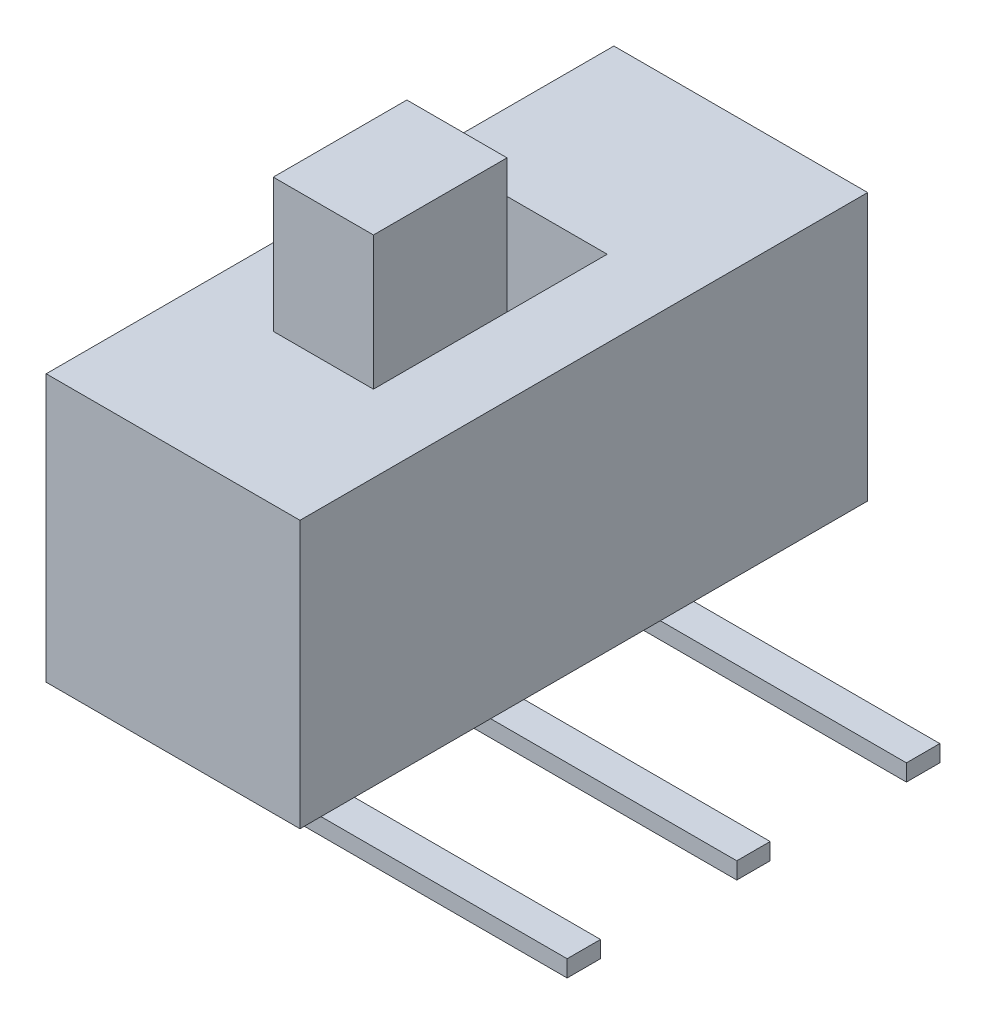
ISO-10303-21;
HEADER;
FILE_DESCRIPTION(('STEP AP214'),'2;1');
FILE_NAME('part.step','',(''),(''),'','','');
FILE_SCHEMA(('AUTOMOTIVE_DESIGN { 1 0 10303 214 1 1 1 1 }'));
ENDSEC;
DATA;
#1=APPLICATION_CONTEXT('core data for automotive mechanical design processes');
#2=APPLICATION_PROTOCOL_DEFINITION('international standard','automotive_design',2000,#1);
#3=PRODUCT_CONTEXT('',#1,'mechanical');
#4=PRODUCT('Part','Part','',(#3));
#5=PRODUCT_RELATED_PRODUCT_CATEGORY('part','',(#4));
#6=PRODUCT_DEFINITION_FORMATION('','',#4);
#7=PRODUCT_DEFINITION_CONTEXT('part definition',#1,'design');
#8=PRODUCT_DEFINITION('design','',#6,#7);
#9=PRODUCT_DEFINITION_SHAPE('','',#8);
#10=(LENGTH_UNIT() NAMED_UNIT(*) SI_UNIT(.MILLI.,.METRE.));
#11=(NAMED_UNIT(*) PLANE_ANGLE_UNIT() SI_UNIT($,.RADIAN.));
#12=(NAMED_UNIT(*) SI_UNIT($,.STERADIAN.) SOLID_ANGLE_UNIT());
#13=UNCERTAINTY_MEASURE_WITH_UNIT(LENGTH_MEASURE(1.E-05),#10,'distance_accuracy_value','');
#14=(GEOMETRIC_REPRESENTATION_CONTEXT(3) GLOBAL_UNCERTAINTY_ASSIGNED_CONTEXT((#13)) GLOBAL_UNIT_ASSIGNED_CONTEXT((#10,
#11,#12)) REPRESENTATION_CONTEXT('',''));
#15=CARTESIAN_POINT('',(0.,0.,0.));
#16=DIRECTION('',(0.,0.,1.));
#17=DIRECTION('',(1.,0.,0.));
#18=AXIS2_PLACEMENT_3D('',#15,#16,#17);
#19=CARTESIAN_POINT('',(-1.9,0.,4.25));
#20=DIRECTION('',(0.,1.,0.));
#21=DIRECTION('',(0.,0.,1.));
#22=AXIS2_PLACEMENT_3D('',#19,#20,#21);
#23=PLANE('',#22);
#24=DIRECTION('',(-1.,0.,0.));
#25=VECTOR('',#24,1.);
#26=CARTESIAN_POINT('',(-0.124999999999999,0.,2.79));
#27=LINE('',#26,#25);
#28=CARTESIAN_POINT('',(0.125000000000001,0.,2.79));
#29=VERTEX_POINT('',#28);
#30=CARTESIAN_POINT('',(-0.124999999999999,0.,2.79));
#31=VERTEX_POINT('',#30);
#32=EDGE_CURVE('E282',#29,#31,#27,.T.);
#33=ORIENTED_EDGE('',*,*,#32,.F.);
#34=DIRECTION('',(0.,0.,1.));
#35=VECTOR('',#34,1.);
#36=CARTESIAN_POINT('',(0.125000000000001,0.,2.79));
#37=LINE('',#36,#35);
#38=CARTESIAN_POINT('',(0.125000000000001,0.,2.29));
#39=VERTEX_POINT('',#38);
#40=EDGE_CURVE('E292',#39,#29,#37,.T.);
#41=ORIENTED_EDGE('',*,*,#40,.F.);
#42=DIRECTION('',(1.,0.,0.));
#43=VECTOR('',#42,1.);
#44=CARTESIAN_POINT('',(-0.124999999999999,0.,2.29));
#45=LINE('',#44,#43);
#46=CARTESIAN_POINT('',(-0.124999999999999,0.,2.29));
#47=VERTEX_POINT('',#46);
#48=EDGE_CURVE('E289',#47,#39,#45,.T.);
#49=ORIENTED_EDGE('',*,*,#48,.F.);
#50=DIRECTION('',(0.,0.,-1.));
#51=VECTOR('',#50,1.);
#52=CARTESIAN_POINT('',(-0.124999999999999,0.,2.79));
#53=LINE('',#52,#51);
#54=EDGE_CURVE('E285',#31,#47,#53,.T.);
#55=ORIENTED_EDGE('',*,*,#54,.F.);
#56=EDGE_LOOP('',(#33,#41,#49,#55));
#57=FACE_BOUND('',#56,.T.);
#58=DIRECTION('',(0.,0.,1.));
#59=VECTOR('',#58,1.);
#60=CARTESIAN_POINT('',(-1.9,0.,-4.25));
#61=LINE('',#60,#59);
#62=CARTESIAN_POINT('',(-1.9,0.,-4.25));
#63=VERTEX_POINT('',#62);
#64=CARTESIAN_POINT('',(-1.9,0.,4.25));
#65=VERTEX_POINT('',#64);
#66=EDGE_CURVE('E389',#63,#65,#61,.T.);
#67=ORIENTED_EDGE('',*,*,#66,.F.);
#68=DIRECTION('',(-1.,0.,0.));
#69=VECTOR('',#68,1.);
#70=CARTESIAN_POINT('',(-1.9,0.,-4.25));
#71=LINE('',#70,#69);
#72=CARTESIAN_POINT('',(1.9,0.,-4.25));
#73=VERTEX_POINT('',#72);
#74=EDGE_CURVE('E381',#73,#63,#71,.T.);
#75=ORIENTED_EDGE('',*,*,#74,.F.);
#76=DIRECTION('',(0.,0.,-1.));
#77=VECTOR('',#76,1.);
#78=CARTESIAN_POINT('',(1.9,0.,-4.25));
#79=LINE('',#78,#77);
#80=CARTESIAN_POINT('',(1.90000000000002,0.,4.25));
#81=VERTEX_POINT('',#80);
#82=EDGE_CURVE('E376',#81,#73,#79,.T.);
#83=ORIENTED_EDGE('',*,*,#82,.F.);
#84=DIRECTION('',(1.,0.,0.));
#85=VECTOR('',#84,1.);
#86=CARTESIAN_POINT('',(-1.9,0.,4.25));
#87=LINE('',#86,#85);
#88=EDGE_CURVE('E377',#65,#81,#87,.T.);
#89=ORIENTED_EDGE('',*,*,#88,.F.);
#90=EDGE_LOOP('',(#67,#75,#83,#89));
#91=FACE_BOUND('',#90,.T.);
#92=DIRECTION('',(0.,0.,-1.));
#93=VECTOR('',#92,1.);
#94=CARTESIAN_POINT('',(-0.124999999999999,0.,0.25));
#95=LINE('',#94,#93);
#96=CARTESIAN_POINT('',(-0.124999999999999,0.,0.25));
#97=VERTEX_POINT('',#96);
#98=CARTESIAN_POINT('',(-0.124999999999999,0.,-0.25));
#99=VERTEX_POINT('',#98);
#100=EDGE_CURVE('E266',#97,#99,#95,.T.);
#101=ORIENTED_EDGE('',*,*,#100,.F.);
#102=DIRECTION('',(-1.,0.,0.));
#103=VECTOR('',#102,1.);
#104=CARTESIAN_POINT('',(-0.124999999999999,0.,0.25));
#105=LINE('',#104,#103);
#106=CARTESIAN_POINT('',(0.125000000000001,0.,0.25));
#107=VERTEX_POINT('',#106);
#108=EDGE_CURVE('E343',#107,#97,#105,.T.);
#109=ORIENTED_EDGE('',*,*,#108,.F.);
#110=DIRECTION('',(0.,0.,1.));
#111=VECTOR('',#110,1.);
#112=CARTESIAN_POINT('',(0.125000000000001,0.,0.25));
#113=LINE('',#112,#111);
#114=CARTESIAN_POINT('',(0.125000000000001,0.,-0.25));
#115=VERTEX_POINT('',#114);
#116=EDGE_CURVE('E340',#115,#107,#113,.T.);
#117=ORIENTED_EDGE('',*,*,#116,.F.);
#118=DIRECTION('',(1.,0.,0.));
#119=VECTOR('',#118,1.);
#120=CARTESIAN_POINT('',(-0.124999999999999,0.,-0.25));
#121=LINE('',#120,#119);
#122=EDGE_CURVE('E337',#99,#115,#121,.T.);
#123=ORIENTED_EDGE('',*,*,#122,.F.);
#124=EDGE_LOOP('',(#101,#109,#117,#123));
#125=FACE_BOUND('',#124,.T.);
#126=DIRECTION('',(0.,0.,-1.));
#127=VECTOR('',#126,1.);
#128=CARTESIAN_POINT('',(-0.124999999999999,0.,-2.79));
#129=LINE('',#128,#127);
#130=CARTESIAN_POINT('',(-0.124999999999999,0.,-2.29));
#131=VERTEX_POINT('',#130);
#132=CARTESIAN_POINT('',(-0.124999999999999,0.,-2.79));
#133=VERTEX_POINT('',#132);
#134=EDGE_CURVE('E60',#131,#133,#129,.T.);
#135=ORIENTED_EDGE('',*,*,#134,.F.);
#136=DIRECTION('',(-1.,0.,0.));
#137=VECTOR('',#136,1.);
#138=CARTESIAN_POINT('',(-0.124999999999999,0.,-2.29));
#139=LINE('',#138,#137);
#140=CARTESIAN_POINT('',(0.125000000000001,0.,-2.29));
#141=VERTEX_POINT('',#140);
#142=EDGE_CURVE('E218',#141,#131,#139,.T.);
#143=ORIENTED_EDGE('',*,*,#142,.F.);
#144=DIRECTION('',(0.,0.,1.));
#145=VECTOR('',#144,1.);
#146=CARTESIAN_POINT('',(0.125000000000001,0.,-2.79));
#147=LINE('',#146,#145);
#148=CARTESIAN_POINT('',(0.125000000000001,0.,-2.79));
#149=VERTEX_POINT('',#148);
#150=EDGE_CURVE('E215',#149,#141,#147,.T.);
#151=ORIENTED_EDGE('',*,*,#150,.F.);
#152=DIRECTION('',(1.,0.,0.));
#153=VECTOR('',#152,1.);
#154=CARTESIAN_POINT('',(-0.124999999999999,0.,-2.79));
#155=LINE('',#154,#153);
#156=EDGE_CURVE('E65',#133,#149,#155,.T.);
#157=ORIENTED_EDGE('',*,*,#156,.F.);
#158=EDGE_LOOP('',(#135,#143,#151,#157));
#159=FACE_BOUND('',#158,.T.);
#160=ADVANCED_FACE('F43',(#57,#91,#125,#159),#23,.F.);
#161=CARTESIAN_POINT('',(-1.9,4.,4.25));
#162=DIRECTION('',(0.,1.,0.));
#163=DIRECTION('',(0.,0.,1.));
#164=AXIS2_PLACEMENT_3D('',#161,#162,#163);
#165=PLANE('',#164);
#166=DIRECTION('',(-1.,0.,0.));
#167=VECTOR('',#166,1.);
#168=CARTESIAN_POINT('',(0.75,4.,-1.5));
#169=LINE('',#168,#167);
#170=CARTESIAN_POINT('',(0.75,4.,-1.5));
#171=VERTEX_POINT('',#170);
#172=CARTESIAN_POINT('',(-0.75,4.,-1.5));
#173=VERTEX_POINT('',#172);
#174=EDGE_CURVE('E407',#171,#173,#169,.T.);
#175=ORIENTED_EDGE('',*,*,#174,.F.);
#176=DIRECTION('',(0.,0.,-1.));
#177=VECTOR('',#176,1.);
#178=CARTESIAN_POINT('',(0.75,4.,0.));
#179=LINE('',#178,#177);
#180=CARTESIAN_POINT('',(0.75,4.,2.));
#181=VERTEX_POINT('',#180);
#182=EDGE_CURVE('E385',#181,#171,#179,.T.);
#183=ORIENTED_EDGE('',*,*,#182,.F.);
#184=DIRECTION('',(1.,0.,0.));
#185=VECTOR('',#184,1.);
#186=CARTESIAN_POINT('',(0.75,4.,2.));
#187=LINE('',#186,#185);
#188=CARTESIAN_POINT('',(-0.75,4.,2.));
#189=VERTEX_POINT('',#188);
#190=EDGE_CURVE('E47',#189,#181,#187,.T.);
#191=ORIENTED_EDGE('',*,*,#190,.F.);
#192=DIRECTION('',(0.,0.,1.));
#193=VECTOR('',#192,1.);
#194=CARTESIAN_POINT('',(-0.75,4.,-1.5));
#195=LINE('',#194,#193);
#196=EDGE_CURVE('E410',#173,#189,#195,.T.);
#197=ORIENTED_EDGE('',*,*,#196,.F.);
#198=EDGE_LOOP('',(#175,#183,#191,#197));
#199=FACE_BOUND('',#198,.T.);
#200=DIRECTION('',(0.,0.,1.));
#201=VECTOR('',#200,1.);
#202=CARTESIAN_POINT('',(-1.9,4.,-4.25));
#203=LINE('',#202,#201);
#204=CARTESIAN_POINT('',(-1.9,4.,-4.25));
#205=VERTEX_POINT('',#204);
#206=CARTESIAN_POINT('',(-1.9,4.,4.25));
#207=VERTEX_POINT('',#206);
#208=EDGE_CURVE('E322',#205,#207,#203,.T.);
#209=ORIENTED_EDGE('',*,*,#208,.T.);
#210=DIRECTION('',(1.,0.,0.));
#211=VECTOR('',#210,1.);
#212=CARTESIAN_POINT('',(-1.9,4.,4.25));
#213=LINE('',#212,#211);
#214=CARTESIAN_POINT('',(1.90000000000002,4.,4.25));
#215=VERTEX_POINT('',#214);
#216=EDGE_CURVE('E394',#207,#215,#213,.T.);
#217=ORIENTED_EDGE('',*,*,#216,.T.);
#218=DIRECTION('',(0.,0.,-1.));
#219=VECTOR('',#218,1.);
#220=CARTESIAN_POINT('',(1.9,4.,-4.25));
#221=LINE('',#220,#219);
#222=CARTESIAN_POINT('',(1.9,4.,-4.25));
#223=VERTEX_POINT('',#222);
#224=EDGE_CURVE('E392',#215,#223,#221,.T.);
#225=ORIENTED_EDGE('',*,*,#224,.T.);
#226=DIRECTION('',(-1.,0.,0.));
#227=VECTOR('',#226,1.);
#228=CARTESIAN_POINT('',(-1.9,4.,-4.25));
#229=LINE('',#228,#227);
#230=EDGE_CURVE('E390',#223,#205,#229,.T.);
#231=ORIENTED_EDGE('',*,*,#230,.T.);
#232=EDGE_LOOP('',(#209,#217,#225,#231));
#233=FACE_BOUND('',#232,.T.);
#234=ADVANCED_FACE('F437',(#199,#233),#165,.T.);
#235=CARTESIAN_POINT('',(-1.9,4.,-4.25));
#236=DIRECTION('',(1.,0.,0.));
#237=DIRECTION('',(0.,0.,-1.));
#238=AXIS2_PLACEMENT_3D('',#235,#236,#237);
#239=PLANE('',#238);
#240=ORIENTED_EDGE('',*,*,#66,.T.);
#241=DIRECTION('',(0.,-1.,0.));
#242=VECTOR('',#241,1.);
#243=CARTESIAN_POINT('',(-1.9,4.,4.25));
#244=LINE('',#243,#242);
#245=EDGE_CURVE('E373',#207,#65,#244,.T.);
#246=ORIENTED_EDGE('',*,*,#245,.F.);
#247=ORIENTED_EDGE('',*,*,#208,.F.);
#248=DIRECTION('',(0.,-1.,0.));
#249=VECTOR('',#248,1.);
#250=CARTESIAN_POINT('',(-1.9,4.,-4.25));
#251=LINE('',#250,#249);
#252=EDGE_CURVE('E386',#205,#63,#251,.T.);
#253=ORIENTED_EDGE('',*,*,#252,.T.);
#254=EDGE_LOOP('',(#240,#246,#247,#253));
#255=FACE_BOUND('',#254,.T.);
#256=ADVANCED_FACE('F460',(#255),#239,.F.);
#257=CARTESIAN_POINT('',(-1.9,4.,4.25));
#258=DIRECTION('',(0.,0.,-1.));
#259=DIRECTION('',(-1.,0.,0.));
#260=AXIS2_PLACEMENT_3D('',#257,#258,#259);
#261=PLANE('',#260);
#262=ORIENTED_EDGE('',*,*,#88,.T.);
#263=DIRECTION('',(0.,-1.,0.));
#264=VECTOR('',#263,1.);
#265=CARTESIAN_POINT('',(1.90000000000002,4.,4.25));
#266=LINE('',#265,#264);
#267=EDGE_CURVE('E378',#215,#81,#266,.T.);
#268=ORIENTED_EDGE('',*,*,#267,.F.);
#269=ORIENTED_EDGE('',*,*,#216,.F.);
#270=ORIENTED_EDGE('',*,*,#245,.T.);
#271=EDGE_LOOP('',(#262,#268,#269,#270));
#272=FACE_BOUND('',#271,.T.);
#273=ADVANCED_FACE('F680',(#272),#261,.F.);
#274=CARTESIAN_POINT('',(1.9,4.,-4.25));
#275=DIRECTION('',(-1.,0.,0.));
#276=DIRECTION('',(0.,0.,1.));
#277=AXIS2_PLACEMENT_3D('',#274,#275,#276);
#278=PLANE('',#277);
#279=ORIENTED_EDGE('',*,*,#82,.T.);
#280=DIRECTION('',(0.,-1.,0.));
#281=VECTOR('',#280,1.);
#282=CARTESIAN_POINT('',(1.9,4.,-4.25));
#283=LINE('',#282,#281);
#284=EDGE_CURVE('E382',#223,#73,#283,.T.);
#285=ORIENTED_EDGE('',*,*,#284,.F.);
#286=ORIENTED_EDGE('',*,*,#224,.F.);
#287=ORIENTED_EDGE('',*,*,#267,.T.);
#288=EDGE_LOOP('',(#279,#285,#286,#287));
#289=FACE_BOUND('',#288,.T.);
#290=ADVANCED_FACE('F684',(#289),#278,.F.);
#291=CARTESIAN_POINT('',(-1.9,4.,-4.25));
#292=DIRECTION('',(0.,0.,1.));
#293=DIRECTION('',(1.,0.,0.));
#294=AXIS2_PLACEMENT_3D('',#291,#292,#293);
#295=PLANE('',#294);
#296=ORIENTED_EDGE('',*,*,#74,.T.);
#297=ORIENTED_EDGE('',*,*,#252,.F.);
#298=ORIENTED_EDGE('',*,*,#230,.F.);
#299=ORIENTED_EDGE('',*,*,#284,.T.);
#300=EDGE_LOOP('',(#296,#297,#298,#299));
#301=FACE_BOUND('',#300,.T.);
#302=ADVANCED_FACE('F466',(#301),#295,.F.);
#303=CARTESIAN_POINT('',(0.75,2.,-1.5));
#304=DIRECTION('',(1.,0.,0.));
#305=DIRECTION('',(0.,0.,-1.));
#306=AXIS2_PLACEMENT_3D('',#303,#304,#305);
#307=PLANE('',#306);
#308=ORIENTED_EDGE('',*,*,#182,.T.);
#309=DIRECTION('',(0.,1.,0.));
#310=VECTOR('',#309,1.);
#311=CARTESIAN_POINT('',(0.75,2.,-1.5));
#312=LINE('',#311,#310);
#313=CARTESIAN_POINT('',(0.75,2.,-1.5));
#314=VERTEX_POINT('',#313);
#315=EDGE_CURVE('E403',#314,#171,#312,.T.);
#316=ORIENTED_EDGE('',*,*,#315,.F.);
#317=DIRECTION('',(0.,0.,-1.));
#318=VECTOR('',#317,1.);
#319=CARTESIAN_POINT('',(0.75,2.,-1.5));
#320=LINE('',#319,#318);
#321=CARTESIAN_POINT('',(0.75,2.,2.));
#322=VERTEX_POINT('',#321);
#323=EDGE_CURVE('E406',#322,#314,#320,.T.);
#324=ORIENTED_EDGE('',*,*,#323,.F.);
#325=DIRECTION('',(0.,1.,0.));
#326=VECTOR('',#325,1.);
#327=CARTESIAN_POINT('',(0.75,2.,2.));
#328=LINE('',#327,#326);
#329=EDGE_CURVE('E414',#322,#181,#328,.T.);
#330=ORIENTED_EDGE('',*,*,#329,.T.);
#331=EDGE_LOOP('',(#308,#316,#324,#330));
#332=FACE_BOUND('',#331,.T.);
#333=ADVANCED_FACE('F428',(#332),#307,.F.);
#334=CARTESIAN_POINT('',(0.75,2.,2.));
#335=DIRECTION('',(0.,0.,1.));
#336=DIRECTION('',(1.,0.,0.));
#337=AXIS2_PLACEMENT_3D('',#334,#335,#336);
#338=PLANE('',#337);
#339=ORIENTED_EDGE('',*,*,#190,.T.);
#340=ORIENTED_EDGE('',*,*,#329,.F.);
#341=DIRECTION('',(1.,0.,0.));
#342=VECTOR('',#341,1.);
#343=CARTESIAN_POINT('',(0.75,2.,2.));
#344=LINE('',#343,#342);
#345=CARTESIAN_POINT('',(-0.75,2.,2.));
#346=VERTEX_POINT('',#345);
#347=EDGE_CURVE('E13',#346,#322,#344,.T.);
#348=ORIENTED_EDGE('',*,*,#347,.F.);
#349=DIRECTION('',(0.,1.,0.));
#350=VECTOR('',#349,1.);
#351=CARTESIAN_POINT('',(-0.75,2.,2.));
#352=LINE('',#351,#350);
#353=EDGE_CURVE('E411',#346,#189,#352,.T.);
#354=ORIENTED_EDGE('',*,*,#353,.T.);
#355=EDGE_LOOP('',(#339,#340,#348,#354));
#356=FACE_BOUND('',#355,.T.);
#357=ADVANCED_FACE('F444',(#356),#338,.F.);
#358=CARTESIAN_POINT('',(-0.75,2.,-1.5));
#359=DIRECTION('',(-1.,0.,0.));
#360=DIRECTION('',(0.,0.,1.));
#361=AXIS2_PLACEMENT_3D('',#358,#359,#360);
#362=PLANE('',#361);
#363=ORIENTED_EDGE('',*,*,#196,.T.);
#364=ORIENTED_EDGE('',*,*,#353,.F.);
#365=DIRECTION('',(0.,0.,1.));
#366=VECTOR('',#365,1.);
#367=CARTESIAN_POINT('',(-0.75,2.,-1.5));
#368=LINE('',#367,#366);
#369=CARTESIAN_POINT('',(-0.75,2.,-1.5));
#370=VERTEX_POINT('',#369);
#371=EDGE_CURVE('E52',#370,#346,#368,.T.);
#372=ORIENTED_EDGE('',*,*,#371,.F.);
#373=DIRECTION('',(0.,1.,0.));
#374=VECTOR('',#373,1.);
#375=CARTESIAN_POINT('',(-0.75,2.,-1.5));
#376=LINE('',#375,#374);
#377=EDGE_CURVE('E408',#370,#173,#376,.T.);
#378=ORIENTED_EDGE('',*,*,#377,.T.);
#379=EDGE_LOOP('',(#363,#364,#372,#378));
#380=FACE_BOUND('',#379,.T.);
#381=ADVANCED_FACE('F440',(#380),#362,.F.);
#382=CARTESIAN_POINT('',(0.75,2.,-1.5));
#383=DIRECTION('',(0.,0.,-1.));
#384=DIRECTION('',(-1.,0.,0.));
#385=AXIS2_PLACEMENT_3D('',#382,#383,#384);
#386=PLANE('',#385);
#387=ORIENTED_EDGE('',*,*,#174,.T.);
#388=ORIENTED_EDGE('',*,*,#377,.F.);
#389=DIRECTION('',(-1.,0.,0.));
#390=VECTOR('',#389,1.);
#391=CARTESIAN_POINT('',(0.75,2.,-1.5));
#392=LINE('',#391,#390);
#393=EDGE_CURVE('E419',#314,#370,#392,.T.);
#394=ORIENTED_EDGE('',*,*,#393,.F.);
#395=ORIENTED_EDGE('',*,*,#315,.T.);
#396=EDGE_LOOP('',(#387,#388,#394,#395));
#397=FACE_BOUND('',#396,.T.);
#398=ADVANCED_FACE('F435',(#397),#386,.F.);
#399=CARTESIAN_POINT('',(0.75,2.,2.));
#400=DIRECTION('',(0.,-1.,0.));
#401=DIRECTION('',(0.,0.,-1.));
#402=AXIS2_PLACEMENT_3D('',#399,#400,#401);
#403=PLANE('',#402);
#404=ORIENTED_EDGE('',*,*,#323,.T.);
#405=ORIENTED_EDGE('',*,*,#393,.T.);
#406=ORIENTED_EDGE('',*,*,#371,.T.);
#407=ORIENTED_EDGE('',*,*,#347,.T.);
#408=EDGE_LOOP('',(#404,#405,#406,#407));
#409=FACE_BOUND('',#408,.T.);
#410=ADVANCED_FACE('F45',(#409),#403,.F.);
#411=CARTESIAN_POINT('',(0.125000000000002,-1.145,0.250000000000001));
#412=DIRECTION('',(0.,1.,0.));
#413=DIRECTION('',(0.,0.,1.));
#414=AXIS2_PLACEMENT_3D('',#411,#412,#413);
#415=PLANE('',#414);
#416=DIRECTION('',(1.,0.,0.));
#417=VECTOR('',#416,1.);
#418=CARTESIAN_POINT('',(0.125000000000002,-1.145,0.25));
#419=LINE('',#418,#417);
#420=CARTESIAN_POINT('',(0.125000000000002,-1.145,0.25));
#421=VERTEX_POINT('',#420);
#422=CARTESIAN_POINT('',(4.44000000000002,-1.145,0.25));
#423=VERTEX_POINT('',#422);
#424=EDGE_CURVE('E359',#421,#423,#419,.T.);
#425=ORIENTED_EDGE('',*,*,#424,.T.);
#426=DIRECTION('',(0.,0.,-1.));
#427=VECTOR('',#426,1.);
#428=CARTESIAN_POINT('',(4.44000000000002,-1.145,0.250000000000001));
#429=LINE('',#428,#427);
#430=CARTESIAN_POINT('',(4.44000000000002,-1.145,-0.25));
#431=VERTEX_POINT('',#430);
#432=EDGE_CURVE('E323',#423,#431,#429,.T.);
#433=ORIENTED_EDGE('',*,*,#432,.T.);
#434=DIRECTION('',(1.,0.,0.));
#435=VECTOR('',#434,1.);
#436=CARTESIAN_POINT('',(0.125000000000002,-1.145,-0.25));
#437=LINE('',#436,#435);
#438=CARTESIAN_POINT('',(0.125000000000002,-1.145,-0.25));
#439=VERTEX_POINT('',#438);
#440=EDGE_CURVE('E362',#439,#431,#437,.T.);
#441=ORIENTED_EDGE('',*,*,#440,.F.);
#442=DIRECTION('',(0.,0.,1.));
#443=VECTOR('',#442,1.);
#444=CARTESIAN_POINT('',(0.125000000000002,-1.145,0.250000000000001));
#445=LINE('',#444,#443);
#446=EDGE_CURVE('E330',#439,#421,#445,.T.);
#447=ORIENTED_EDGE('',*,*,#446,.T.);
#448=EDGE_LOOP('',(#425,#433,#441,#447));
#449=FACE_BOUND('',#448,.T.);
#450=ADVANCED_FACE('F447',(#449),#415,.T.);
#451=CARTESIAN_POINT('',(-0.124999999999998,-1.395,0.25));
#452=DIRECTION('',(0.,-1.,0.));
#453=DIRECTION('',(0.,0.,-1.));
#454=AXIS2_PLACEMENT_3D('',#451,#452,#453);
#455=PLANE('',#454);
#456=DIRECTION('',(1.,0.,0.));
#457=VECTOR('',#456,1.);
#458=CARTESIAN_POINT('',(-0.124999999999998,-1.395,-0.25));
#459=LINE('',#458,#457);
#460=CARTESIAN_POINT('',(-0.124999999999998,-1.395,-0.25));
#461=VERTEX_POINT('',#460);
#462=CARTESIAN_POINT('',(4.44000000000002,-1.395,-0.25));
#463=VERTEX_POINT('',#462);
#464=EDGE_CURVE('E365',#461,#463,#459,.T.);
#465=ORIENTED_EDGE('',*,*,#464,.T.);
#466=DIRECTION('',(0.,0.,1.));
#467=VECTOR('',#466,1.);
#468=CARTESIAN_POINT('',(4.44000000000002,-1.395,0.25));
#469=LINE('',#468,#467);
#470=CARTESIAN_POINT('',(4.44000000000002,-1.395,0.25));
#471=VERTEX_POINT('',#470);
#472=EDGE_CURVE('E329',#463,#471,#469,.T.);
#473=ORIENTED_EDGE('',*,*,#472,.T.);
#474=DIRECTION('',(1.,0.,0.));
#475=VECTOR('',#474,1.);
#476=CARTESIAN_POINT('',(-0.124999999999998,-1.395,0.25));
#477=LINE('',#476,#475);
#478=CARTESIAN_POINT('',(-0.124999999999998,-1.395,0.25));
#479=VERTEX_POINT('',#478);
#480=EDGE_CURVE('E368',#479,#471,#477,.T.);
#481=ORIENTED_EDGE('',*,*,#480,.F.);
#482=DIRECTION('',(0.,0.,-1.));
#483=VECTOR('',#482,1.);
#484=CARTESIAN_POINT('',(-0.124999999999998,-1.395,0.25));
#485=LINE('',#484,#483);
#486=EDGE_CURVE('E333',#479,#461,#485,.T.);
#487=ORIENTED_EDGE('',*,*,#486,.T.);
#488=EDGE_LOOP('',(#465,#473,#481,#487));
#489=FACE_BOUND('',#488,.T.);
#490=ADVANCED_FACE('F451',(#489),#455,.T.);
#491=CARTESIAN_POINT('',(-0.124999999999998,-1.82901699437495,0.25));
#492=DIRECTION('',(0.,0.,-1.));
#493=DIRECTION('',(-1.,0.,0.));
#494=AXIS2_PLACEMENT_3D('',#491,#492,#493);
#495=PLANE('',#494);
#496=DIRECTION('',(0.,1.,0.));
#497=VECTOR('',#496,1.);
#498=CARTESIAN_POINT('',(-0.124999999999998,-1.82901699437495,0.25));
#499=LINE('',#498,#497);
#500=EDGE_CURVE('E346',#479,#97,#499,.T.);
#501=ORIENTED_EDGE('',*,*,#500,.F.);
#502=ORIENTED_EDGE('',*,*,#480,.T.);
#503=DIRECTION('',(0.,1.,0.));
#504=VECTOR('',#503,1.);
#505=CARTESIAN_POINT('',(4.44000000000002,-1.61200849718747,0.25));
#506=LINE('',#505,#504);
#507=EDGE_CURVE('E326',#471,#423,#506,.T.);
#508=ORIENTED_EDGE('',*,*,#507,.T.);
#509=ORIENTED_EDGE('',*,*,#424,.F.);
#510=DIRECTION('',(0.,1.,0.));
#511=VECTOR('',#510,1.);
#512=CARTESIAN_POINT('',(0.125000000000002,-1.82901699437495,0.25));
#513=LINE('',#512,#511);
#514=EDGE_CURVE('E349',#421,#107,#513,.T.);
#515=ORIENTED_EDGE('',*,*,#514,.T.);
#516=ORIENTED_EDGE('',*,*,#108,.T.);
#517=EDGE_LOOP('',(#501,#502,#508,#509,#515,#516));
#518=FACE_BOUND('',#517,.T.);
#519=ADVANCED_FACE('F501',(#518),#495,.F.);
#520=CARTESIAN_POINT('',(0.125000000000002,-1.82901699437495,0.25));
#521=DIRECTION('',(-1.,0.,0.));
#522=DIRECTION('',(0.,-1.,0.));
#523=AXIS2_PLACEMENT_3D('',#520,#521,#522);
#524=PLANE('',#523);
#525=ORIENTED_EDGE('',*,*,#446,.F.);
#526=DIRECTION('',(0.,1.,0.));
#527=VECTOR('',#526,1.);
#528=CARTESIAN_POINT('',(0.125000000000002,-1.82901699437495,-0.25));
#529=LINE('',#528,#527);
#530=EDGE_CURVE('E352',#439,#115,#529,.T.);
#531=ORIENTED_EDGE('',*,*,#530,.T.);
#532=ORIENTED_EDGE('',*,*,#116,.T.);
#533=ORIENTED_EDGE('',*,*,#514,.F.);
#534=EDGE_LOOP('',(#525,#531,#532,#533));
#535=FACE_BOUND('',#534,.T.);
#536=ADVANCED_FACE('F511',(#535),#524,.F.);
#537=CARTESIAN_POINT('',(-0.124999999999998,-1.82901699437495,-0.25));
#538=DIRECTION('',(0.,0.,1.));
#539=DIRECTION('',(1.,0.,0.));
#540=AXIS2_PLACEMENT_3D('',#537,#538,#539);
#541=PLANE('',#540);
#542=ORIENTED_EDGE('',*,*,#530,.F.);
#543=ORIENTED_EDGE('',*,*,#440,.T.);
#544=DIRECTION('',(0.,-1.,0.));
#545=VECTOR('',#544,1.);
#546=CARTESIAN_POINT('',(4.44000000000002,-1.61200849718747,-0.25));
#547=LINE('',#546,#545);
#548=EDGE_CURVE('E319',#431,#463,#547,.T.);
#549=ORIENTED_EDGE('',*,*,#548,.T.);
#550=ORIENTED_EDGE('',*,*,#464,.F.);
#551=DIRECTION('',(0.,1.,0.));
#552=VECTOR('',#551,1.);
#553=CARTESIAN_POINT('',(-0.124999999999998,-1.82901699437495,-0.25));
#554=LINE('',#553,#552);
#555=EDGE_CURVE('E334',#461,#99,#554,.T.);
#556=ORIENTED_EDGE('',*,*,#555,.T.);
#557=ORIENTED_EDGE('',*,*,#122,.T.);
#558=EDGE_LOOP('',(#542,#543,#549,#550,#556,#557));
#559=FACE_BOUND('',#558,.T.);
#560=ADVANCED_FACE('F520',(#559),#541,.F.);
#561=CARTESIAN_POINT('',(-0.124999999999998,-1.82901699437495,0.25));
#562=DIRECTION('',(1.,0.,0.));
#563=DIRECTION('',(0.,1.,0.));
#564=AXIS2_PLACEMENT_3D('',#561,#562,#563);
#565=PLANE('',#564);
#566=ORIENTED_EDGE('',*,*,#486,.F.);
#567=ORIENTED_EDGE('',*,*,#500,.T.);
#568=ORIENTED_EDGE('',*,*,#100,.T.);
#569=ORIENTED_EDGE('',*,*,#555,.F.);
#570=EDGE_LOOP('',(#566,#567,#568,#569));
#571=FACE_BOUND('',#570,.T.);
#572=ADVANCED_FACE('F530',(#571),#565,.F.);
#573=CARTESIAN_POINT('',(4.44000000000002,-1.27,0.));
#574=DIRECTION('',(1.,0.,0.));
#575=DIRECTION('',(0.,1.,0.));
#576=AXIS2_PLACEMENT_3D('',#573,#574,#575);
#577=PLANE('',#576);
#578=ORIENTED_EDGE('',*,*,#472,.F.);
#579=ORIENTED_EDGE('',*,*,#548,.F.);
#580=ORIENTED_EDGE('',*,*,#432,.F.);
#581=ORIENTED_EDGE('',*,*,#507,.F.);
#582=EDGE_LOOP('',(#578,#579,#580,#581));
#583=FACE_BOUND('',#582,.T.);
#584=ADVANCED_FACE('F539',(#583),#577,.T.);
#585=CARTESIAN_POINT('',(-0.124999999999998,-1.395,2.79));
#586=DIRECTION('',(0.,-1.,0.));
#587=DIRECTION('',(0.,0.,-1.));
#588=AXIS2_PLACEMENT_3D('',#585,#586,#587);
#589=PLANE('',#588);
#590=DIRECTION('',(1.,0.,0.));
#591=VECTOR('',#590,1.);
#592=CARTESIAN_POINT('',(-0.124999999999999,-1.395,2.29));
#593=LINE('',#592,#591);
#594=CARTESIAN_POINT('',(-0.124999999999999,-1.395,2.29));
#595=VERTEX_POINT('',#594);
#596=CARTESIAN_POINT('',(4.44000000000002,-1.395,2.29));
#597=VERTEX_POINT('',#596);
#598=EDGE_CURVE('E314',#595,#597,#593,.T.);
#599=ORIENTED_EDGE('',*,*,#598,.T.);
#600=DIRECTION('',(0.,0.,1.));
#601=VECTOR('',#600,1.);
#602=CARTESIAN_POINT('',(4.44000000000002,-1.395,2.79));
#603=LINE('',#602,#601);
#604=CARTESIAN_POINT('',(4.44000000000002,-1.395,2.79));
#605=VERTEX_POINT('',#604);
#606=EDGE_CURVE('E270',#597,#605,#603,.T.);
#607=ORIENTED_EDGE('',*,*,#606,.T.);
#608=DIRECTION('',(1.,0.,0.));
#609=VECTOR('',#608,1.);
#610=CARTESIAN_POINT('',(-0.124999999999999,-1.395,2.79));
#611=LINE('',#610,#609);
#612=CARTESIAN_POINT('',(-0.124999999999999,-1.395,2.79));
#613=VERTEX_POINT('',#612);
#614=EDGE_CURVE('E281',#613,#605,#611,.T.);
#615=ORIENTED_EDGE('',*,*,#614,.F.);
#616=DIRECTION('',(0.,0.,-1.));
#617=VECTOR('',#616,1.);
#618=CARTESIAN_POINT('',(-0.124999999999998,-1.395,2.79));
#619=LINE('',#618,#617);
#620=EDGE_CURVE('E277',#613,#595,#619,.T.);
#621=ORIENTED_EDGE('',*,*,#620,.T.);
#622=EDGE_LOOP('',(#599,#607,#615,#621));
#623=FACE_BOUND('',#622,.T.);
#624=ADVANCED_FACE('F548',(#623),#589,.T.);
#625=CARTESIAN_POINT('',(0.125000000000002,-1.145,2.79));
#626=DIRECTION('',(0.,1.,0.));
#627=DIRECTION('',(0.,0.,1.));
#628=AXIS2_PLACEMENT_3D('',#625,#626,#627);
#629=PLANE('',#628);
#630=DIRECTION('',(1.,0.,0.));
#631=VECTOR('',#630,1.);
#632=CARTESIAN_POINT('',(0.125000000000002,-1.145,2.79));
#633=LINE('',#632,#631);
#634=CARTESIAN_POINT('',(0.125000000000002,-1.145,2.79));
#635=VERTEX_POINT('',#634);
#636=CARTESIAN_POINT('',(4.44000000000002,-1.145,2.79));
#637=VERTEX_POINT('',#636);
#638=EDGE_CURVE('E308',#635,#637,#633,.T.);
#639=ORIENTED_EDGE('',*,*,#638,.T.);
#640=DIRECTION('',(0.,0.,-1.));
#641=VECTOR('',#640,1.);
#642=CARTESIAN_POINT('',(4.44000000000002,-1.145,2.79));
#643=LINE('',#642,#641);
#644=CARTESIAN_POINT('',(4.44000000000002,-1.145,2.29));
#645=VERTEX_POINT('',#644);
#646=EDGE_CURVE('E263',#637,#645,#643,.T.);
#647=ORIENTED_EDGE('',*,*,#646,.T.);
#648=DIRECTION('',(1.,0.,0.));
#649=VECTOR('',#648,1.);
#650=CARTESIAN_POINT('',(0.125000000000002,-1.145,2.29));
#651=LINE('',#650,#649);
#652=CARTESIAN_POINT('',(0.125000000000002,-1.145,2.29));
#653=VERTEX_POINT('',#652);
#654=EDGE_CURVE('E311',#653,#645,#651,.T.);
#655=ORIENTED_EDGE('',*,*,#654,.F.);
#656=DIRECTION('',(0.,0.,1.));
#657=VECTOR('',#656,1.);
#658=CARTESIAN_POINT('',(0.125000000000002,-1.145,2.79));
#659=LINE('',#658,#657);
#660=EDGE_CURVE('E274',#653,#635,#659,.T.);
#661=ORIENTED_EDGE('',*,*,#660,.T.);
#662=EDGE_LOOP('',(#639,#647,#655,#661));
#663=FACE_BOUND('',#662,.T.);
#664=ADVANCED_FACE('F557',(#663),#629,.T.);
#665=CARTESIAN_POINT('',(-0.124999999999998,-1.82901699437495,2.79));
#666=DIRECTION('',(1.,0.,0.));
#667=DIRECTION('',(0.,1.,0.));
#668=AXIS2_PLACEMENT_3D('',#665,#666,#667);
#669=PLANE('',#668);
#670=ORIENTED_EDGE('',*,*,#620,.F.);
#671=DIRECTION('',(0.,1.,0.));
#672=VECTOR('',#671,1.);
#673=CARTESIAN_POINT('',(-0.124999999999998,-1.82901699437495,2.79));
#674=LINE('',#673,#672);
#675=EDGE_CURVE('E278',#613,#31,#674,.T.);
#676=ORIENTED_EDGE('',*,*,#675,.T.);
#677=ORIENTED_EDGE('',*,*,#54,.T.);
#678=DIRECTION('',(0.,1.,0.));
#679=VECTOR('',#678,1.);
#680=CARTESIAN_POINT('',(-0.124999999999998,-1.82901699437495,2.29));
#681=LINE('',#680,#679);
#682=EDGE_CURVE('E301',#595,#47,#681,.T.);
#683=ORIENTED_EDGE('',*,*,#682,.F.);
#684=EDGE_LOOP('',(#670,#676,#677,#683));
#685=FACE_BOUND('',#684,.T.);
#686=ADVANCED_FACE('F566',(#685),#669,.F.);
#687=CARTESIAN_POINT('',(-0.124999999999998,-1.82901699437495,2.29));
#688=DIRECTION('',(0.,0.,1.));
#689=DIRECTION('',(1.,0.,0.));
#690=AXIS2_PLACEMENT_3D('',#687,#688,#689);
#691=PLANE('',#690);
#692=DIRECTION('',(0.,1.,0.));
#693=VECTOR('',#692,1.);
#694=CARTESIAN_POINT('',(0.125000000000002,-1.82901699437495,2.29));
#695=LINE('',#694,#693);
#696=EDGE_CURVE('E298',#653,#39,#695,.T.);
#697=ORIENTED_EDGE('',*,*,#696,.F.);
#698=ORIENTED_EDGE('',*,*,#654,.T.);
#699=DIRECTION('',(0.,-1.,0.));
#700=VECTOR('',#699,1.);
#701=CARTESIAN_POINT('',(4.44000000000002,-1.61200849718747,2.29));
#702=LINE('',#701,#700);
#703=EDGE_CURVE('E273',#645,#597,#702,.T.);
#704=ORIENTED_EDGE('',*,*,#703,.T.);
#705=ORIENTED_EDGE('',*,*,#598,.F.);
#706=ORIENTED_EDGE('',*,*,#682,.T.);
#707=ORIENTED_EDGE('',*,*,#48,.T.);
#708=EDGE_LOOP('',(#697,#698,#704,#705,#706,#707));
#709=FACE_BOUND('',#708,.T.);
#710=ADVANCED_FACE('F575',(#709),#691,.F.);
#711=CARTESIAN_POINT('',(0.125000000000002,-1.82901699437495,2.79));
#712=DIRECTION('',(-1.,0.,0.));
#713=DIRECTION('',(0.,-1.,0.));
#714=AXIS2_PLACEMENT_3D('',#711,#712,#713);
#715=PLANE('',#714);
#716=ORIENTED_EDGE('',*,*,#660,.F.);
#717=ORIENTED_EDGE('',*,*,#696,.T.);
#718=ORIENTED_EDGE('',*,*,#40,.T.);
#719=DIRECTION('',(0.,1.,0.));
#720=VECTOR('',#719,1.);
#721=CARTESIAN_POINT('',(0.125000000000002,-1.82901699437495,2.79));
#722=LINE('',#721,#720);
#723=EDGE_CURVE('E295',#635,#29,#722,.T.);
#724=ORIENTED_EDGE('',*,*,#723,.F.);
#725=EDGE_LOOP('',(#716,#717,#718,#724));
#726=FACE_BOUND('',#725,.T.);
#727=ADVANCED_FACE('F585',(#726),#715,.F.);
#728=CARTESIAN_POINT('',(-0.124999999999998,-1.82901699437495,2.79));
#729=DIRECTION('',(0.,0.,-1.));
#730=DIRECTION('',(-1.,0.,0.));
#731=AXIS2_PLACEMENT_3D('',#728,#729,#730);
#732=PLANE('',#731);
#733=ORIENTED_EDGE('',*,*,#675,.F.);
#734=ORIENTED_EDGE('',*,*,#614,.T.);
#735=DIRECTION('',(0.,1.,0.));
#736=VECTOR('',#735,1.);
#737=CARTESIAN_POINT('',(4.44000000000002,-1.61200849718747,2.79));
#738=LINE('',#737,#736);
#739=EDGE_CURVE('E267',#605,#637,#738,.T.);
#740=ORIENTED_EDGE('',*,*,#739,.T.);
#741=ORIENTED_EDGE('',*,*,#638,.F.);
#742=ORIENTED_EDGE('',*,*,#723,.T.);
#743=ORIENTED_EDGE('',*,*,#32,.T.);
#744=EDGE_LOOP('',(#733,#734,#740,#741,#742,#743));
#745=FACE_BOUND('',#744,.T.);
#746=ADVANCED_FACE('F594',(#745),#732,.F.);
#747=CARTESIAN_POINT('',(4.44000000000002,-1.27,2.54));
#748=DIRECTION('',(1.,0.,0.));
#749=DIRECTION('',(0.,1.,0.));
#750=AXIS2_PLACEMENT_3D('',#747,#748,#749);
#751=PLANE('',#750);
#752=ORIENTED_EDGE('',*,*,#703,.F.);
#753=ORIENTED_EDGE('',*,*,#646,.F.);
#754=ORIENTED_EDGE('',*,*,#739,.F.);
#755=ORIENTED_EDGE('',*,*,#606,.F.);
#756=EDGE_LOOP('',(#752,#753,#754,#755));
#757=FACE_BOUND('',#756,.T.);
#758=ADVANCED_FACE('F604',(#757),#751,.T.);
#759=CARTESIAN_POINT('',(-0.124999999999998,-1.395,-2.79));
#760=DIRECTION('',(0.,-1.,0.));
#761=DIRECTION('',(0.,0.,-1.));
#762=AXIS2_PLACEMENT_3D('',#759,#760,#761);
#763=PLANE('',#762);
#764=DIRECTION('',(1.,0.,0.));
#765=VECTOR('',#764,1.);
#766=CARTESIAN_POINT('',(-0.124999999999998,-1.395,-2.79));
#767=LINE('',#766,#765);
#768=CARTESIAN_POINT('',(-0.124999999999998,-1.395,-2.79));
#769=VERTEX_POINT('',#768);
#770=CARTESIAN_POINT('',(4.44000000000002,-1.395,-2.79));
#771=VERTEX_POINT('',#770);
#772=EDGE_CURVE('E248',#769,#771,#767,.T.);
#773=ORIENTED_EDGE('',*,*,#772,.T.);
#774=DIRECTION('',(0.,0.,1.));
#775=VECTOR('',#774,1.);
#776=CARTESIAN_POINT('',(4.44000000000002,-1.395,-2.79));
#777=LINE('',#776,#775);
#778=CARTESIAN_POINT('',(4.44000000000002,-1.395,-2.29));
#779=VERTEX_POINT('',#778);
#780=EDGE_CURVE('E743',#771,#779,#777,.T.);
#781=ORIENTED_EDGE('',*,*,#780,.T.);
#782=DIRECTION('',(1.,0.,0.));
#783=VECTOR('',#782,1.);
#784=CARTESIAN_POINT('',(-0.124999999999998,-1.395,-2.29));
#785=LINE('',#784,#783);
#786=CARTESIAN_POINT('',(-0.124999999999998,-1.395,-2.29));
#787=VERTEX_POINT('',#786);
#788=EDGE_CURVE('E251',#787,#779,#785,.T.);
#789=ORIENTED_EDGE('',*,*,#788,.F.);
#790=DIRECTION('',(0.,0.,-1.));
#791=VECTOR('',#790,1.);
#792=CARTESIAN_POINT('',(-0.124999999999998,-1.395,-2.79));
#793=LINE('',#792,#791);
#794=EDGE_CURVE('E245',#787,#769,#793,.T.);
#795=ORIENTED_EDGE('',*,*,#794,.T.);
#796=EDGE_LOOP('',(#773,#781,#789,#795));
#797=FACE_BOUND('',#796,.T.);
#798=ADVANCED_FACE('F613',(#797),#763,.T.);
#799=CARTESIAN_POINT('',(0.125000000000002,-1.145,-2.79));
#800=DIRECTION('',(0.,1.,0.));
#801=DIRECTION('',(0.,0.,1.));
#802=AXIS2_PLACEMENT_3D('',#799,#800,#801);
#803=PLANE('',#802);
#804=DIRECTION('',(1.,0.,0.));
#805=VECTOR('',#804,1.);
#806=CARTESIAN_POINT('',(0.125000000000002,-1.145,-2.29));
#807=LINE('',#806,#805);
#808=CARTESIAN_POINT('',(0.125000000000002,-1.145,-2.29));
#809=VERTEX_POINT('',#808);
#810=CARTESIAN_POINT('',(4.44000000000002,-1.145,-2.29));
#811=VERTEX_POINT('',#810);
#812=EDGE_CURVE('E254',#809,#811,#807,.T.);
#813=ORIENTED_EDGE('',*,*,#812,.T.);
#814=DIRECTION('',(0.,0.,-1.));
#815=VECTOR('',#814,1.);
#816=CARTESIAN_POINT('',(4.44000000000002,-1.145,-2.79));
#817=LINE('',#816,#815);
#818=CARTESIAN_POINT('',(4.44000000000002,-1.145,-2.79));
#819=VERTEX_POINT('',#818);
#820=EDGE_CURVE('E259',#811,#819,#817,.T.);
#821=ORIENTED_EDGE('',*,*,#820,.T.);
#822=DIRECTION('',(1.,0.,0.));
#823=VECTOR('',#822,1.);
#824=CARTESIAN_POINT('',(0.125000000000002,-1.145,-2.79));
#825=LINE('',#824,#823);
#826=CARTESIAN_POINT('',(0.125000000000002,-1.145,-2.79));
#827=VERTEX_POINT('',#826);
#828=EDGE_CURVE('E257',#827,#819,#825,.T.);
#829=ORIENTED_EDGE('',*,*,#828,.F.);
#830=DIRECTION('',(0.,0.,1.));
#831=VECTOR('',#830,1.);
#832=CARTESIAN_POINT('',(0.125000000000002,-1.145,-2.79));
#833=LINE('',#832,#831);
#834=EDGE_CURVE('E228',#827,#809,#833,.T.);
#835=ORIENTED_EDGE('',*,*,#834,.T.);
#836=EDGE_LOOP('',(#813,#821,#829,#835));
#837=FACE_BOUND('',#836,.T.);
#838=ADVANCED_FACE('F622',(#837),#803,.T.);
#839=CARTESIAN_POINT('',(-0.124999999999998,-1.82901699437495,-2.79));
#840=DIRECTION('',(0.,0.,1.));
#841=DIRECTION('',(1.,0.,0.));
#842=AXIS2_PLACEMENT_3D('',#839,#840,#841);
#843=PLANE('',#842);
#844=DIRECTION('',(0.,1.,0.));
#845=VECTOR('',#844,1.);
#846=CARTESIAN_POINT('',(0.125000000000002,-1.82901699437495,-2.79));
#847=LINE('',#846,#845);
#848=EDGE_CURVE('E225',#827,#149,#847,.T.);
#849=ORIENTED_EDGE('',*,*,#848,.F.);
#850=ORIENTED_EDGE('',*,*,#828,.T.);
#851=DIRECTION('',(0.,-1.,0.));
#852=VECTOR('',#851,1.);
#853=CARTESIAN_POINT('',(4.44000000000002,-1.61200849718747,-2.79));
#854=LINE('',#853,#852);
#855=EDGE_CURVE('E262',#819,#771,#854,.T.);
#856=ORIENTED_EDGE('',*,*,#855,.T.);
#857=ORIENTED_EDGE('',*,*,#772,.F.);
#858=DIRECTION('',(0.,1.,0.));
#859=VECTOR('',#858,1.);
#860=CARTESIAN_POINT('',(-0.124999999999998,-1.82901699437495,-2.79));
#861=LINE('',#860,#859);
#862=EDGE_CURVE('E231',#769,#133,#861,.T.);
#863=ORIENTED_EDGE('',*,*,#862,.T.);
#864=ORIENTED_EDGE('',*,*,#156,.T.);
#865=EDGE_LOOP('',(#849,#850,#856,#857,#863,#864));
#866=FACE_BOUND('',#865,.T.);
#867=ADVANCED_FACE('F234',(#866),#843,.F.);
#868=CARTESIAN_POINT('',(0.125000000000002,-1.82901699437495,-2.79));
#869=DIRECTION('',(-1.,0.,0.));
#870=DIRECTION('',(0.,-1.,0.));
#871=AXIS2_PLACEMENT_3D('',#868,#869,#870);
#872=PLANE('',#871);
#873=ORIENTED_EDGE('',*,*,#834,.F.);
#874=ORIENTED_EDGE('',*,*,#848,.T.);
#875=ORIENTED_EDGE('',*,*,#150,.T.);
#876=DIRECTION('',(0.,1.,0.));
#877=VECTOR('',#876,1.);
#878=CARTESIAN_POINT('',(0.125000000000002,-1.82901699437495,-2.29));
#879=LINE('',#878,#877);
#880=EDGE_CURVE('E232',#809,#141,#879,.T.);
#881=ORIENTED_EDGE('',*,*,#880,.F.);
#882=EDGE_LOOP('',(#873,#874,#875,#881));
#883=FACE_BOUND('',#882,.T.);
#884=ADVANCED_FACE('F226',(#883),#872,.F.);
#885=CARTESIAN_POINT('',(-0.124999999999998,-1.82901699437495,-2.29));
#886=DIRECTION('',(0.,0.,-1.));
#887=DIRECTION('',(-1.,0.,0.));
#888=AXIS2_PLACEMENT_3D('',#885,#886,#887);
#889=PLANE('',#888);
#890=DIRECTION('',(0.,1.,0.));
#891=VECTOR('',#890,1.);
#892=CARTESIAN_POINT('',(-0.124999999999998,-1.82901699437495,-2.29));
#893=LINE('',#892,#891);
#894=EDGE_CURVE('E241',#787,#131,#893,.T.);
#895=ORIENTED_EDGE('',*,*,#894,.F.);
#896=ORIENTED_EDGE('',*,*,#788,.T.);
#897=DIRECTION('',(0.,1.,0.));
#898=VECTOR('',#897,1.);
#899=CARTESIAN_POINT('',(4.44000000000002,-1.61200849718747,-2.29));
#900=LINE('',#899,#898);
#901=EDGE_CURVE('E286',#779,#811,#900,.T.);
#902=ORIENTED_EDGE('',*,*,#901,.T.);
#903=ORIENTED_EDGE('',*,*,#812,.F.);
#904=ORIENTED_EDGE('',*,*,#880,.T.);
#905=ORIENTED_EDGE('',*,*,#142,.T.);
#906=EDGE_LOOP('',(#895,#896,#902,#903,#904,#905));
#907=FACE_BOUND('',#906,.T.);
#908=ADVANCED_FACE('F647',(#907),#889,.F.);
#909=CARTESIAN_POINT('',(-0.124999999999998,-1.82901699437495,-2.79));
#910=DIRECTION('',(1.,0.,0.));
#911=DIRECTION('',(0.,1.,0.));
#912=AXIS2_PLACEMENT_3D('',#909,#910,#911);
#913=PLANE('',#912);
#914=ORIENTED_EDGE('',*,*,#794,.F.);
#915=ORIENTED_EDGE('',*,*,#894,.T.);
#916=ORIENTED_EDGE('',*,*,#134,.T.);
#917=ORIENTED_EDGE('',*,*,#862,.F.);
#918=EDGE_LOOP('',(#914,#915,#916,#917));
#919=FACE_BOUND('',#918,.T.);
#920=ADVANCED_FACE('F656',(#919),#913,.F.);
#921=CARTESIAN_POINT('',(4.44000000000002,-1.27,-2.54));
#922=DIRECTION('',(1.,0.,0.));
#923=DIRECTION('',(0.,1.,0.));
#924=AXIS2_PLACEMENT_3D('',#921,#922,#923);
#925=PLANE('',#924);
#926=ORIENTED_EDGE('',*,*,#820,.F.);
#927=ORIENTED_EDGE('',*,*,#901,.F.);
#928=ORIENTED_EDGE('',*,*,#780,.F.);
#929=ORIENTED_EDGE('',*,*,#855,.F.);
#930=EDGE_LOOP('',(#926,#927,#928,#929));
#931=FACE_BOUND('',#930,.T.);
#932=ADVANCED_FACE('F665',(#931),#925,.T.);
#933=CLOSED_SHELL('',(#160,#234,#256,#273,#290,#302,#333,#357,#381,#398,#410,#450,#490,#519,
#536,#560,#572,#584,#624,#664,#686,#710,#727,#746,#758,#798,#838,#867,#884,#908,#920,#932));
#934=MANIFOLD_SOLID_BREP('B2',#933);
#935=CARTESIAN_POINT('',(0.75,6.,2.));
#936=DIRECTION('',(0.,-1.,0.));
#937=DIRECTION('',(0.,0.,-1.));
#938=AXIS2_PLACEMENT_3D('',#935,#936,#937);
#939=PLANE('',#938);
#940=DIRECTION('',(0.,0.,-1.));
#941=VECTOR('',#940,1.);
#942=CARTESIAN_POINT('',(0.75,6.,0.));
#943=LINE('',#942,#941);
#944=CARTESIAN_POINT('',(0.75,6.,2.));
#945=VERTEX_POINT('',#944);
#946=CARTESIAN_POINT('',(0.75,6.,0.));
#947=VERTEX_POINT('',#946);
#948=EDGE_CURVE('E810',#945,#947,#943,.T.);
#949=ORIENTED_EDGE('',*,*,#948,.T.);
#950=DIRECTION('',(-1.,0.,0.));
#951=VECTOR('',#950,1.);
#952=CARTESIAN_POINT('',(0.75,6.,0.));
#953=LINE('',#952,#951);
#954=CARTESIAN_POINT('',(-0.75,6.,0.));
#955=VERTEX_POINT('',#954);
#956=EDGE_CURVE('E836',#947,#955,#953,.T.);
#957=ORIENTED_EDGE('',*,*,#956,.T.);
#958=DIRECTION('',(0.,0.,1.));
#959=VECTOR('',#958,1.);
#960=CARTESIAN_POINT('',(-0.75,6.,0.));
#961=LINE('',#960,#959);
#962=CARTESIAN_POINT('',(-0.75,6.,2.));
#963=VERTEX_POINT('',#962);
#964=EDGE_CURVE('E826',#955,#963,#961,.T.);
#965=ORIENTED_EDGE('',*,*,#964,.T.);
#966=DIRECTION('',(1.,0.,0.));
#967=VECTOR('',#966,1.);
#968=CARTESIAN_POINT('',(0.75,6.,2.));
#969=LINE('',#968,#967);
#970=EDGE_CURVE('E817',#963,#945,#969,.T.);
#971=ORIENTED_EDGE('',*,*,#970,.T.);
#972=EDGE_LOOP('',(#949,#957,#965,#971));
#973=FACE_BOUND('',#972,.T.);
#974=ADVANCED_FACE('F768',(#973),#939,.F.);
#975=CARTESIAN_POINT('',(0.75,6.,2.));
#976=DIRECTION('',(0.,0.,-1.));
#977=DIRECTION('',(-1.,0.,0.));
#978=AXIS2_PLACEMENT_3D('',#975,#976,#977);
#979=PLANE('',#978);
#980=DIRECTION('',(1.,0.,0.));
#981=VECTOR('',#980,1.);
#982=CARTESIAN_POINT('',(0.75,4.,2.));
#983=LINE('',#982,#981);
#984=CARTESIAN_POINT('',(-0.75,4.,2.));
#985=VERTEX_POINT('',#984);
#986=CARTESIAN_POINT('',(0.75,4.,2.));
#987=VERTEX_POINT('',#986);
#988=EDGE_CURVE('E805',#985,#987,#983,.T.);
#989=ORIENTED_EDGE('',*,*,#988,.T.);
#990=DIRECTION('',(0.,-1.,0.));
#991=VECTOR('',#990,1.);
#992=CARTESIAN_POINT('',(0.75,6.,2.));
#993=LINE('',#992,#991);
#994=EDGE_CURVE('E821',#945,#987,#993,.T.);
#995=ORIENTED_EDGE('',*,*,#994,.F.);
#996=ORIENTED_EDGE('',*,*,#970,.F.);
#997=DIRECTION('',(0.,-1.,0.));
#998=VECTOR('',#997,1.);
#999=CARTESIAN_POINT('',(-0.75,6.,2.));
#1000=LINE('',#999,#998);
#1001=EDGE_CURVE('E815',#963,#985,#1000,.T.);
#1002=ORIENTED_EDGE('',*,*,#1001,.T.);
#1003=EDGE_LOOP('',(#989,#995,#996,#1002));
#1004=FACE_BOUND('',#1003,.T.);
#1005=ADVANCED_FACE('F816',(#1004),#979,.F.);
#1006=CARTESIAN_POINT('',(-0.75,6.,0.));
#1007=DIRECTION('',(1.,0.,0.));
#1008=DIRECTION('',(0.,0.,-1.));
#1009=AXIS2_PLACEMENT_3D('',#1006,#1007,#1008);
#1010=PLANE('',#1009);
#1011=DIRECTION('',(0.,0.,1.));
#1012=VECTOR('',#1011,1.);
#1013=CARTESIAN_POINT('',(-0.75,4.,0.));
#1014=LINE('',#1013,#1012);
#1015=CARTESIAN_POINT('',(-0.75,4.,0.));
#1016=VERTEX_POINT('',#1015);
#1017=EDGE_CURVE('E41',#1016,#985,#1014,.T.);
#1018=ORIENTED_EDGE('',*,*,#1017,.T.);
#1019=ORIENTED_EDGE('',*,*,#1001,.F.);
#1020=ORIENTED_EDGE('',*,*,#964,.F.);
#1021=DIRECTION('',(0.,-1.,0.));
#1022=VECTOR('',#1021,1.);
#1023=CARTESIAN_POINT('',(-0.75,6.,0.));
#1024=LINE('',#1023,#1022);
#1025=EDGE_CURVE('E820',#955,#1016,#1024,.T.);
#1026=ORIENTED_EDGE('',*,*,#1025,.T.);
#1027=EDGE_LOOP('',(#1018,#1019,#1020,#1026));
#1028=FACE_BOUND('',#1027,.T.);
#1029=ADVANCED_FACE('F823',(#1028),#1010,.F.);
#1030=CARTESIAN_POINT('',(0.75,6.,0.));
#1031=DIRECTION('',(0.,0.,1.));
#1032=DIRECTION('',(1.,0.,0.));
#1033=AXIS2_PLACEMENT_3D('',#1030,#1031,#1032);
#1034=PLANE('',#1033);
#1035=DIRECTION('',(-1.,0.,0.));
#1036=VECTOR('',#1035,1.);
#1037=CARTESIAN_POINT('',(0.75,4.,0.));
#1038=LINE('',#1037,#1036);
#1039=CARTESIAN_POINT('',(0.75,4.,0.));
#1040=VERTEX_POINT('',#1039);
#1041=EDGE_CURVE('E811',#1040,#1016,#1038,.T.);
#1042=ORIENTED_EDGE('',*,*,#1041,.T.);
#1043=ORIENTED_EDGE('',*,*,#1025,.F.);
#1044=ORIENTED_EDGE('',*,*,#956,.F.);
#1045=DIRECTION('',(0.,-1.,0.));
#1046=VECTOR('',#1045,1.);
#1047=CARTESIAN_POINT('',(0.75,6.,0.));
#1048=LINE('',#1047,#1046);
#1049=EDGE_CURVE('E772',#947,#1040,#1048,.T.);
#1050=ORIENTED_EDGE('',*,*,#1049,.T.);
#1051=EDGE_LOOP('',(#1042,#1043,#1044,#1050));
#1052=FACE_BOUND('',#1051,.T.);
#1053=ADVANCED_FACE('F829',(#1052),#1034,.F.);
#1054=CARTESIAN_POINT('',(0.75,6.,0.));
#1055=DIRECTION('',(-1.,0.,0.));
#1056=DIRECTION('',(0.,0.,1.));
#1057=AXIS2_PLACEMENT_3D('',#1054,#1055,#1056);
#1058=PLANE('',#1057);
#1059=DIRECTION('',(0.,0.,-1.));
#1060=VECTOR('',#1059,1.);
#1061=CARTESIAN_POINT('',(0.75,4.,0.));
#1062=LINE('',#1061,#1060);
#1063=EDGE_CURVE('E777',#987,#1040,#1062,.T.);
#1064=ORIENTED_EDGE('',*,*,#1063,.T.);
#1065=ORIENTED_EDGE('',*,*,#1049,.F.);
#1066=ORIENTED_EDGE('',*,*,#948,.F.);
#1067=ORIENTED_EDGE('',*,*,#994,.T.);
#1068=EDGE_LOOP('',(#1064,#1065,#1066,#1067));
#1069=FACE_BOUND('',#1068,.T.);
#1070=ADVANCED_FACE('F770',(#1069),#1058,.F.);
#1071=CARTESIAN_POINT('',(0.75,4.,2.));
#1072=DIRECTION('',(0.,-1.,0.));
#1073=DIRECTION('',(0.,0.,-1.));
#1074=AXIS2_PLACEMENT_3D('',#1071,#1072,#1073);
#1075=PLANE('',#1074);
#1076=ORIENTED_EDGE('',*,*,#1041,.F.);
#1077=ORIENTED_EDGE('',*,*,#1063,.F.);
#1078=ORIENTED_EDGE('',*,*,#988,.F.);
#1079=ORIENTED_EDGE('',*,*,#1017,.F.);
#1080=EDGE_LOOP('',(#1076,#1077,#1078,#1079));
#1081=FACE_BOUND('',#1080,.T.);
#1082=ADVANCED_FACE('F807',(#1081),#1075,.T.);
#1083=CLOSED_SHELL('',(#974,#1005,#1029,#1053,#1070,#1082));
#1084=MANIFOLD_SOLID_BREP('B7',#1083);
#1085=ADVANCED_BREP_SHAPE_REPRESENTATION('',(#18,#934,#1084),#14);
#1086=SHAPE_DEFINITION_REPRESENTATION(#9,#1085);
ENDSEC;
END-ISO-10303-21;
